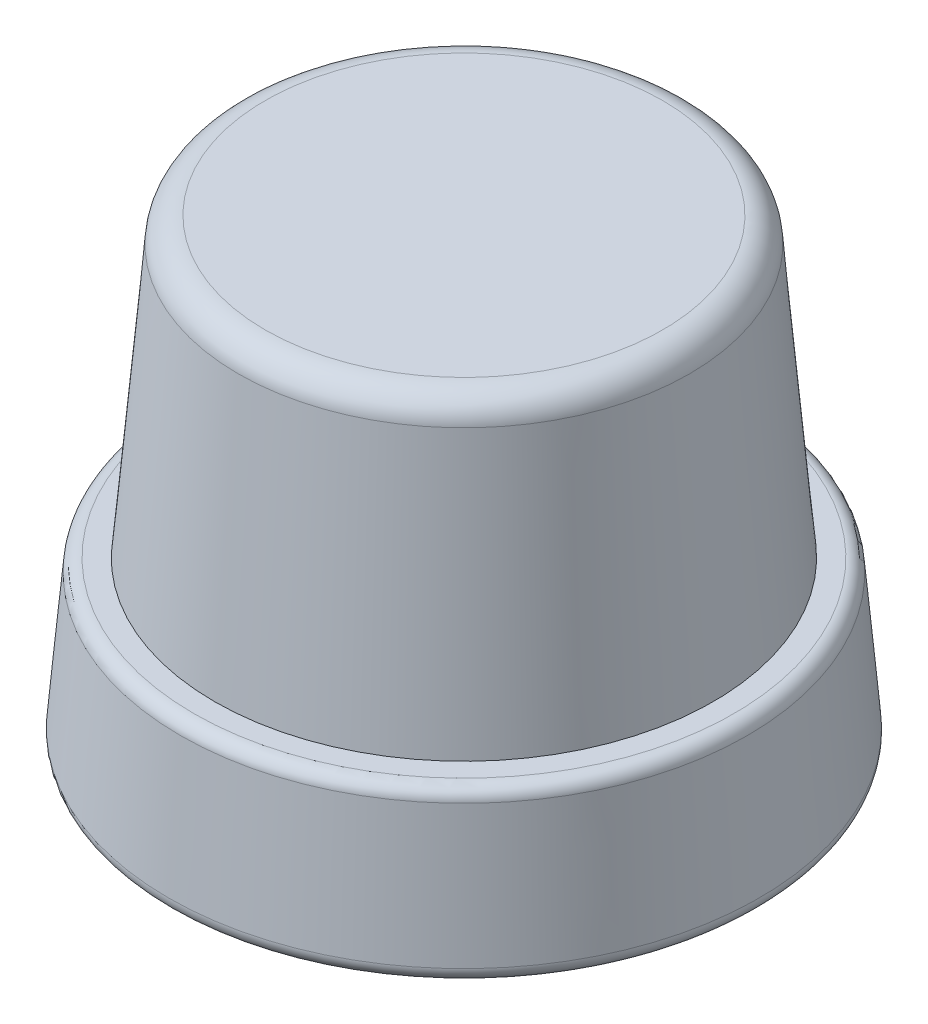
ISO-10303-21;
HEADER;
FILE_DESCRIPTION(('STEP AP214'),'2;1');
FILE_NAME('part.step','',(''),(''),'','','');
FILE_SCHEMA(('AUTOMOTIVE_DESIGN { 1 0 10303 214 1 1 1 1 }'));
ENDSEC;
DATA;
#1=APPLICATION_CONTEXT('core data for automotive mechanical design processes');
#2=APPLICATION_PROTOCOL_DEFINITION('international standard','automotive_design',2000,#1);
#3=PRODUCT_CONTEXT('',#1,'mechanical');
#4=PRODUCT('Part','Part','',(#3));
#5=PRODUCT_RELATED_PRODUCT_CATEGORY('part','',(#4));
#6=PRODUCT_DEFINITION_FORMATION('','',#4);
#7=PRODUCT_DEFINITION_CONTEXT('part definition',#1,'design');
#8=PRODUCT_DEFINITION('design','',#6,#7);
#9=PRODUCT_DEFINITION_SHAPE('','',#8);
#10=(LENGTH_UNIT() NAMED_UNIT(*) SI_UNIT(.MILLI.,.METRE.));
#11=(NAMED_UNIT(*) PLANE_ANGLE_UNIT() SI_UNIT($,.RADIAN.));
#12=(NAMED_UNIT(*) SI_UNIT($,.STERADIAN.) SOLID_ANGLE_UNIT());
#13=UNCERTAINTY_MEASURE_WITH_UNIT(LENGTH_MEASURE(1.E-05),#10,'distance_accuracy_value','');
#14=(GEOMETRIC_REPRESENTATION_CONTEXT(3) GLOBAL_UNCERTAINTY_ASSIGNED_CONTEXT((#13)) GLOBAL_UNIT_ASSIGNED_CONTEXT((#10,
#11,#12)) REPRESENTATION_CONTEXT('',''));
#15=CARTESIAN_POINT('',(0.,0.,0.));
#16=DIRECTION('',(0.,0.,1.));
#17=DIRECTION('',(1.,0.,0.));
#18=AXIS2_PLACEMENT_3D('',#15,#16,#17);
#19=CARTESIAN_POINT('',(0.,0.,0.));
#20=DIRECTION('',(0.,-1.,0.));
#21=DIRECTION('',(0.,0.,1.));
#22=AXIS2_PLACEMENT_3D('',#19,#20,#21);
#23=CONICAL_SURFACE('',#22,11.,0.0872664625997167);
#24=CARTESIAN_POINT('',(0.,0.543577871373824,0.));
#25=DIRECTION('',(0.,1.,0.));
#26=DIRECTION('',(0.,0.,1.));
#27=AXIS2_PLACEMENT_3D('',#24,#25,#26);
#28=CIRCLE('',#27,10.9524430985112);
#29=CARTESIAN_POINT('',(0.,0.543577871373824,10.9524430985112));
#30=VERTEX_POINT('',#29);
#31=EDGE_CURVE('E37',#30,#30,#28,.T.);
#32=ORIENTED_EDGE('',*,*,#31,.T.);
#33=EDGE_LOOP('',(#32));
#34=FACE_BOUND('',#33,.T.);
#35=CARTESIAN_POINT('',(0.,5.54357787137383,0.));
#36=DIRECTION('',(0.,-1.,0.));
#37=DIRECTION('',(0.,0.,-1.));
#38=AXIS2_PLACEMENT_3D('',#35,#36,#37);
#39=CIRCLE('',#38,10.5149997808816);
#40=CARTESIAN_POINT('',(0.,5.54357787137383,-10.5149997808816));
#41=VERTEX_POINT('',#40);
#42=EDGE_CURVE('E41',#41,#41,#39,.T.);
#43=ORIENTED_EDGE('',*,*,#42,.T.);
#44=EDGE_LOOP('',(#43));
#45=FACE_BOUND('',#44,.T.);
#46=ADVANCED_FACE('F30',(#34,#45),#23,.T.);
#47=CARTESIAN_POINT('',(0.,6.,0.));
#48=DIRECTION('',(0.,1.,0.));
#49=DIRECTION('',(0.,0.,1.));
#50=AXIS2_PLACEMENT_3D('',#47,#48,#49);
#51=PLANE('',#50);
#52=CARTESIAN_POINT('',(0.,6.,0.));
#53=DIRECTION('',(0.,1.,0.));
#54=DIRECTION('',(0.,0.,1.));
#55=AXIS2_PLACEMENT_3D('',#52,#53,#54);
#56=CIRCLE('',#55,10.0169024318357);
#57=CARTESIAN_POINT('',(0.,6.,10.0169024318357));
#58=VERTEX_POINT('',#57);
#59=EDGE_CURVE('E45',#58,#58,#56,.T.);
#60=ORIENTED_EDGE('',*,*,#59,.T.);
#61=EDGE_LOOP('',(#60));
#62=FACE_BOUND('',#61,.T.);
#63=CARTESIAN_POINT('',(0.,6.,0.));
#64=DIRECTION('',(0.,1.,0.));
#65=DIRECTION('',(0.,0.,1.));
#66=AXIS2_PLACEMENT_3D('',#63,#64,#65);
#67=CIRCLE('',#66,9.25);
#68=CARTESIAN_POINT('',(0.,6.,9.25));
#69=VERTEX_POINT('',#68);
#70=EDGE_CURVE('E56',#69,#69,#67,.T.);
#71=ORIENTED_EDGE('',*,*,#70,.F.);
#72=EDGE_LOOP('',(#71));
#73=FACE_BOUND('',#72,.T.);
#74=ADVANCED_FACE('F78',(#62,#73),#51,.T.);
#75=CARTESIAN_POINT('',(0.,0.,0.));
#76=DIRECTION('',(0.,1.,0.));
#77=DIRECTION('',(0.,0.,1.));
#78=AXIS2_PLACEMENT_3D('',#75,#76,#77);
#79=PLANE('',#78);
#80=CARTESIAN_POINT('',(0.,0.,0.));
#81=DIRECTION('',(0.,1.,0.));
#82=DIRECTION('',(0.,0.,1.));
#83=AXIS2_PLACEMENT_3D('',#80,#81,#82);
#84=CIRCLE('',#83,10.4543457494654);
#85=CARTESIAN_POINT('',(0.,0.,10.4543457494654));
#86=VERTEX_POINT('',#85);
#87=EDGE_CURVE('E10',#86,#86,#84,.F.);
#88=ORIENTED_EDGE('',*,*,#87,.T.);
#89=EDGE_LOOP('',(#88));
#90=FACE_BOUND('',#89,.T.);
#91=CARTESIAN_POINT('',(0.,0.,0.));
#92=DIRECTION('',(0.,-1.,0.));
#93=DIRECTION('',(0.,0.,-1.));
#94=AXIS2_PLACEMENT_3D('',#91,#92,#93);
#95=CIRCLE('',#94,3.05);
#96=CARTESIAN_POINT('',(0.,0.,-3.05));
#97=VERTEX_POINT('',#96);
#98=EDGE_CURVE('E60',#97,#97,#95,.T.);
#99=ORIENTED_EDGE('',*,*,#98,.F.);
#100=EDGE_LOOP('',(#99));
#101=FACE_BOUND('',#100,.T.);
#102=ADVANCED_FACE('F75',(#90,#101),#79,.F.);
#103=CARTESIAN_POINT('',(0.,6.,0.));
#104=DIRECTION('',(0.,-1.,0.));
#105=DIRECTION('',(0.,0.,1.));
#106=AXIS2_PLACEMENT_3D('',#103,#104,#105);
#107=CONICAL_SURFACE('',#106,9.25,0.0872664625997167);
#108=CARTESIAN_POINT('',(0.,16.0871557427477,0.));
#109=DIRECTION('',(0.,-1.,0.));
#110=DIRECTION('',(0.,0.,-1.));
#111=AXIS2_PLACEMENT_3D('',#108,#109,#110);
#112=CIRCLE('',#111,8.36748822528915);
#113=CARTESIAN_POINT('',(0.,16.0871557427477,-8.36748822528915));
#114=VERTEX_POINT('',#113);
#115=EDGE_CURVE('E50',#114,#114,#112,.T.);
#116=ORIENTED_EDGE('',*,*,#115,.T.);
#117=EDGE_LOOP('',(#116));
#118=FACE_BOUND('',#117,.T.);
#119=ORIENTED_EDGE('',*,*,#70,.T.);
#120=EDGE_LOOP('',(#119));
#121=FACE_BOUND('',#120,.T.);
#122=ADVANCED_FACE('F77',(#118,#121),#107,.T.);
#123=CARTESIAN_POINT('',(0.,17.,0.));
#124=DIRECTION('',(0.,1.,0.));
#125=DIRECTION('',(0.,0.,1.));
#126=AXIS2_PLACEMENT_3D('',#123,#124,#125);
#127=PLANE('',#126);
#128=CARTESIAN_POINT('',(0.,17.,0.));
#129=DIRECTION('',(0.,1.,0.));
#130=DIRECTION('',(0.,0.,1.));
#131=AXIS2_PLACEMENT_3D('',#128,#129,#130);
#132=CIRCLE('',#131,7.37129352719741);
#133=CARTESIAN_POINT('',(0.,17.,7.37129352719741));
#134=VERTEX_POINT('',#133);
#135=EDGE_CURVE('E53',#134,#134,#132,.T.);
#136=ORIENTED_EDGE('',*,*,#135,.T.);
#137=EDGE_LOOP('',(#136));
#138=FACE_BOUND('',#137,.T.);
#139=ADVANCED_FACE('F71',(#138),#127,.T.);
#140=CARTESIAN_POINT('',(0.,8.,0.));
#141=DIRECTION('',(0.,-1.,0.));
#142=DIRECTION('',(0.,0.,-1.));
#143=AXIS2_PLACEMENT_3D('',#140,#141,#142);
#144=CYLINDRICAL_SURFACE('',#143,3.05);
#145=CARTESIAN_POINT('',(0.,8.,0.));
#146=DIRECTION('',(0.,-1.,0.));
#147=DIRECTION('',(0.,0.,-1.));
#148=AXIS2_PLACEMENT_3D('',#145,#146,#147);
#149=CIRCLE('',#148,3.05);
#150=CARTESIAN_POINT('',(0.,8.,-3.05));
#151=VERTEX_POINT('',#150);
#152=EDGE_CURVE('E59',#151,#151,#149,.T.);
#153=ORIENTED_EDGE('',*,*,#152,.F.);
#154=EDGE_LOOP('',(#153));
#155=FACE_BOUND('',#154,.T.);
#156=ORIENTED_EDGE('',*,*,#98,.T.);
#157=EDGE_LOOP('',(#156));
#158=FACE_BOUND('',#157,.T.);
#159=ADVANCED_FACE('F68',(#155,#158),#144,.F.);
#160=CARTESIAN_POINT('',(0.,8.,0.));
#161=DIRECTION('',(0.,-1.,0.));
#162=DIRECTION('',(0.,0.,-1.));
#163=AXIS2_PLACEMENT_3D('',#160,#161,#162);
#164=PLANE('',#163);
#165=ORIENTED_EDGE('',*,*,#152,.T.);
#166=EDGE_LOOP('',(#165));
#167=FACE_BOUND('',#166,.T.);
#168=ADVANCED_FACE('F66',(#167),#164,.T.);
#169=CARTESIAN_POINT('',(0.,16.,0.));
#170=DIRECTION('',(0.,1.,0.));
#171=DIRECTION('',(0.,0.,1.));
#172=AXIS2_PLACEMENT_3D('',#169,#170,#171);
#173=TOROIDAL_SURFACE('',#172,7.37129352719741,1.);
#174=ORIENTED_EDGE('',*,*,#115,.F.);
#175=EDGE_LOOP('',(#174));
#176=FACE_BOUND('',#175,.T.);
#177=ORIENTED_EDGE('',*,*,#135,.F.);
#178=EDGE_LOOP('',(#177));
#179=FACE_BOUND('',#178,.T.);
#180=ADVANCED_FACE('F94',(#176,#179),#173,.T.);
#181=CARTESIAN_POINT('',(0.,5.5,0.));
#182=DIRECTION('',(0.,1.,0.));
#183=DIRECTION('',(0.,0.,1.));
#184=AXIS2_PLACEMENT_3D('',#181,#182,#183);
#185=TOROIDAL_SURFACE('',#184,10.0169024318357,0.5);
#186=ORIENTED_EDGE('',*,*,#42,.F.);
#187=EDGE_LOOP('',(#186));
#188=FACE_BOUND('',#187,.T.);
#189=ORIENTED_EDGE('',*,*,#59,.F.);
#190=EDGE_LOOP('',(#189));
#191=FACE_BOUND('',#190,.T.);
#192=ADVANCED_FACE('F96',(#188,#191),#185,.T.);
#193=CARTESIAN_POINT('',(0.,0.5,0.));
#194=DIRECTION('',(0.,1.,0.));
#195=DIRECTION('',(0.,0.,1.));
#196=AXIS2_PLACEMENT_3D('',#193,#194,#195);
#197=TOROIDAL_SURFACE('',#196,10.4543457494654,0.5);
#198=ORIENTED_EDGE('',*,*,#87,.F.);
#199=EDGE_LOOP('',(#198));
#200=FACE_BOUND('',#199,.T.);
#201=ORIENTED_EDGE('',*,*,#31,.F.);
#202=EDGE_LOOP('',(#201));
#203=FACE_BOUND('',#202,.T.);
#204=ADVANCED_FACE('F32',(#200,#203),#197,.T.);
#205=CLOSED_SHELL('',(#46,#74,#102,#122,#139,#159,#168,#180,#192,#204));
#206=MANIFOLD_SOLID_BREP('B2',#205);
#207=ADVANCED_BREP_SHAPE_REPRESENTATION('',(#18,#206),#14);
#208=SHAPE_DEFINITION_REPRESENTATION(#9,#207);
ENDSEC;
END-ISO-10303-21;
